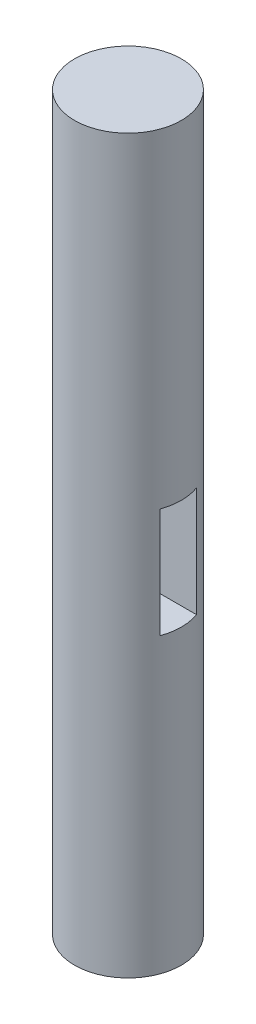
ISO-10303-21;
HEADER;
FILE_DESCRIPTION(('STEP AP214'),'2;1');
FILE_NAME('part.step','',(''),(''),'','','');
FILE_SCHEMA(('AUTOMOTIVE_DESIGN { 1 0 10303 214 1 1 1 1 }'));
ENDSEC;
DATA;
#1=APPLICATION_CONTEXT('core data for automotive mechanical design processes');
#2=APPLICATION_PROTOCOL_DEFINITION('international standard','automotive_design',2000,#1);
#3=PRODUCT_CONTEXT('',#1,'mechanical');
#4=PRODUCT('Part','Part','',(#3));
#5=PRODUCT_RELATED_PRODUCT_CATEGORY('part','',(#4));
#6=PRODUCT_DEFINITION_FORMATION('','',#4);
#7=PRODUCT_DEFINITION_CONTEXT('part definition',#1,'design');
#8=PRODUCT_DEFINITION('design','',#6,#7);
#9=PRODUCT_DEFINITION_SHAPE('','',#8);
#10=(LENGTH_UNIT() NAMED_UNIT(*) SI_UNIT(.MILLI.,.METRE.));
#11=(NAMED_UNIT(*) PLANE_ANGLE_UNIT() SI_UNIT($,.RADIAN.));
#12=(NAMED_UNIT(*) SI_UNIT($,.STERADIAN.) SOLID_ANGLE_UNIT());
#13=UNCERTAINTY_MEASURE_WITH_UNIT(LENGTH_MEASURE(1.E-05),#10,'distance_accuracy_value','');
#14=(GEOMETRIC_REPRESENTATION_CONTEXT(3) GLOBAL_UNCERTAINTY_ASSIGNED_CONTEXT((#13)) GLOBAL_UNIT_ASSIGNED_CONTEXT((#10,
#11,#12)) REPRESENTATION_CONTEXT('',''));
#15=CARTESIAN_POINT('',(0.,0.,0.));
#16=DIRECTION('',(0.,0.,1.));
#17=DIRECTION('',(1.,0.,0.));
#18=AXIS2_PLACEMENT_3D('',#15,#16,#17);
#19=CARTESIAN_POINT('',(0.,127.,0.));
#20=DIRECTION('',(0.,-1.,0.));
#21=DIRECTION('',(0.,0.,-1.));
#22=AXIS2_PLACEMENT_3D('',#19,#20,#21);
#23=CYLINDRICAL_SURFACE('',#22,9.271);
#24=DIRECTION('',(0.,-1.,0.));
#25=VECTOR('',#24,1.);
#26=CARTESIAN_POINT('',(-8.71038552533698,127.,3.17499999999999));
#27=LINE('',#26,#25);
#28=CARTESIAN_POINT('',(-8.71038552533698,69.89064,3.175));
#29=VERTEX_POINT('',#28);
#30=CARTESIAN_POINT('',(-8.71038552533698,50.84064,3.175));
#31=VERTEX_POINT('',#30);
#32=EDGE_CURVE('E11',#29,#31,#27,.T.);
#33=ORIENTED_EDGE('',*,*,#32,.T.);
#34=CARTESIAN_POINT('',(0.,50.84064,0.));
#35=DIRECTION('',(0.,-1.,0.));
#36=DIRECTION('',(0.,0.,-1.));
#37=AXIS2_PLACEMENT_3D('',#34,#35,#36);
#38=CIRCLE('',#37,9.271);
#39=CARTESIAN_POINT('',(-8.71038552533698,50.84064,-3.175));
#40=VERTEX_POINT('',#39);
#41=EDGE_CURVE('E86',#31,#40,#38,.T.);
#42=ORIENTED_EDGE('',*,*,#41,.T.);
#43=DIRECTION('',(0.,-1.,0.));
#44=VECTOR('',#43,1.);
#45=CARTESIAN_POINT('',(-8.71038552533698,127.,-3.17500000000001));
#46=LINE('',#45,#44);
#47=CARTESIAN_POINT('',(-8.71038552533698,69.89064,-3.175));
#48=VERTEX_POINT('',#47);
#49=EDGE_CURVE('E93',#40,#48,#46,.F.);
#50=ORIENTED_EDGE('',*,*,#49,.T.);
#51=CARTESIAN_POINT('',(0.,69.89064,0.));
#52=DIRECTION('',(0.,1.,0.));
#53=DIRECTION('',(0.,0.,1.));
#54=AXIS2_PLACEMENT_3D('',#51,#52,#53);
#55=CIRCLE('',#54,9.271);
#56=EDGE_CURVE('E47',#48,#29,#55,.T.);
#57=ORIENTED_EDGE('',*,*,#56,.T.);
#58=EDGE_LOOP('',(#33,#42,#50,#57));
#59=FACE_BOUND('',#58,.T.);
#60=DIRECTION('',(0.,-1.,0.));
#61=VECTOR('',#60,1.);
#62=CARTESIAN_POINT('',(8.71038552533698,127.,-3.17500000000001));
#63=LINE('',#62,#61);
#64=CARTESIAN_POINT('',(8.71038552533698,69.89064,-3.175));
#65=VERTEX_POINT('',#64);
#66=CARTESIAN_POINT('',(8.71038552533698,50.84064,-3.175));
#67=VERTEX_POINT('',#66);
#68=EDGE_CURVE('E90',#65,#67,#63,.T.);
#69=ORIENTED_EDGE('',*,*,#68,.T.);
#70=CARTESIAN_POINT('',(8.71038552533698,50.84064,3.175));
#71=VERTEX_POINT('',#70);
#72=EDGE_CURVE('E77',#67,#71,#38,.T.);
#73=ORIENTED_EDGE('',*,*,#72,.T.);
#74=DIRECTION('',(0.,-1.,0.));
#75=VECTOR('',#74,1.);
#76=CARTESIAN_POINT('',(8.71038552533698,127.,3.17499999999999));
#77=LINE('',#76,#75);
#78=CARTESIAN_POINT('',(8.71038552533698,69.89064,3.175));
#79=VERTEX_POINT('',#78);
#80=EDGE_CURVE('E101',#71,#79,#77,.F.);
#81=ORIENTED_EDGE('',*,*,#80,.T.);
#82=EDGE_CURVE('E83',#79,#65,#55,.T.);
#83=ORIENTED_EDGE('',*,*,#82,.T.);
#84=EDGE_LOOP('',(#69,#73,#81,#83));
#85=FACE_BOUND('',#84,.T.);
#86=CARTESIAN_POINT('',(0.,127.,0.));
#87=DIRECTION('',(0.,1.,0.));
#88=DIRECTION('',(0.,0.,1.));
#89=AXIS2_PLACEMENT_3D('',#86,#87,#88);
#90=CIRCLE('',#89,9.271);
#91=CARTESIAN_POINT('',(0.,127.,9.271));
#92=VERTEX_POINT('',#91);
#93=EDGE_CURVE('E84',#92,#92,#90,.T.);
#94=ORIENTED_EDGE('',*,*,#93,.F.);
#95=EDGE_LOOP('',(#94));
#96=FACE_BOUND('',#95,.T.);
#97=CARTESIAN_POINT('',(0.,0.,0.));
#98=DIRECTION('',(0.,1.,0.));
#99=DIRECTION('',(0.,0.,1.));
#100=AXIS2_PLACEMENT_3D('',#97,#98,#99);
#101=CIRCLE('',#100,9.271);
#102=CARTESIAN_POINT('',(0.,0.,9.271));
#103=VERTEX_POINT('',#102);
#104=EDGE_CURVE('E115',#103,#103,#101,.T.);
#105=ORIENTED_EDGE('',*,*,#104,.T.);
#106=EDGE_LOOP('',(#105));
#107=FACE_BOUND('',#106,.T.);
#108=ADVANCED_FACE('F39',(#59,#85,#96,#107),#23,.T.);
#109=CARTESIAN_POINT('',(0.,127.,0.));
#110=DIRECTION('',(0.,1.,0.));
#111=DIRECTION('',(0.,0.,1.));
#112=AXIS2_PLACEMENT_3D('',#109,#110,#111);
#113=PLANE('',#112);
#114=ORIENTED_EDGE('',*,*,#93,.T.);
#115=EDGE_LOOP('',(#114));
#116=FACE_BOUND('',#115,.T.);
#117=ADVANCED_FACE('F133',(#116),#113,.T.);
#118=CARTESIAN_POINT('',(0.,0.,0.));
#119=DIRECTION('',(0.,1.,0.));
#120=DIRECTION('',(0.,0.,1.));
#121=AXIS2_PLACEMENT_3D('',#118,#119,#120);
#122=PLANE('',#121);
#123=ORIENTED_EDGE('',*,*,#104,.F.);
#124=EDGE_LOOP('',(#123));
#125=FACE_BOUND('',#124,.T.);
#126=ADVANCED_FACE('F137',(#125),#122,.F.);
#127=CARTESIAN_POINT('',(-9.271,50.84064,3.175));
#128=DIRECTION('',(0.,0.,1.));
#129=DIRECTION('',(0.,-1.,0.));
#130=AXIS2_PLACEMENT_3D('',#127,#128,#129);
#131=PLANE('',#130);
#132=DIRECTION('',(1.,0.,0.));
#133=VECTOR('',#132,1.);
#134=CARTESIAN_POINT('',(-9.271,69.89064,3.175));
#135=LINE('',#134,#133);
#136=EDGE_CURVE('E119',#29,#79,#135,.T.);
#137=ORIENTED_EDGE('',*,*,#136,.T.);
#138=ORIENTED_EDGE('',*,*,#80,.F.);
#139=DIRECTION('',(1.,0.,0.));
#140=VECTOR('',#139,1.);
#141=CARTESIAN_POINT('',(-9.271,50.84064,3.175));
#142=LINE('',#141,#140);
#143=EDGE_CURVE('E59',#31,#71,#142,.T.);
#144=ORIENTED_EDGE('',*,*,#143,.F.);
#145=ORIENTED_EDGE('',*,*,#32,.F.);
#146=EDGE_LOOP('',(#137,#138,#144,#145));
#147=FACE_BOUND('',#146,.T.);
#148=ADVANCED_FACE('F131',(#147),#131,.F.);
#149=CARTESIAN_POINT('',(-9.271,69.89064,3.175));
#150=DIRECTION('',(0.,1.,0.));
#151=DIRECTION('',(0.,0.,1.));
#152=AXIS2_PLACEMENT_3D('',#149,#150,#151);
#153=PLANE('',#152);
#154=ORIENTED_EDGE('',*,*,#136,.F.);
#155=ORIENTED_EDGE('',*,*,#56,.F.);
#156=DIRECTION('',(1.,0.,0.));
#157=VECTOR('',#156,1.);
#158=CARTESIAN_POINT('',(-9.271,69.89064,-3.175));
#159=LINE('',#158,#157);
#160=EDGE_CURVE('E96',#48,#65,#159,.T.);
#161=ORIENTED_EDGE('',*,*,#160,.T.);
#162=ORIENTED_EDGE('',*,*,#82,.F.);
#163=EDGE_LOOP('',(#154,#155,#161,#162));
#164=FACE_BOUND('',#163,.T.);
#165=ADVANCED_FACE('F129',(#164),#153,.F.);
#166=CARTESIAN_POINT('',(-9.271,50.84064,-3.175));
#167=DIRECTION('',(0.,0.,-1.));
#168=DIRECTION('',(0.,1.,0.));
#169=AXIS2_PLACEMENT_3D('',#166,#167,#168);
#170=PLANE('',#169);
#171=ORIENTED_EDGE('',*,*,#160,.F.);
#172=ORIENTED_EDGE('',*,*,#49,.F.);
#173=DIRECTION('',(1.,0.,0.));
#174=VECTOR('',#173,1.);
#175=CARTESIAN_POINT('',(-9.271,50.84064,-3.175));
#176=LINE('',#175,#174);
#177=EDGE_CURVE('E54',#40,#67,#176,.T.);
#178=ORIENTED_EDGE('',*,*,#177,.T.);
#179=ORIENTED_EDGE('',*,*,#68,.F.);
#180=EDGE_LOOP('',(#171,#172,#178,#179));
#181=FACE_BOUND('',#180,.T.);
#182=ADVANCED_FACE('F89',(#181),#170,.F.);
#183=CARTESIAN_POINT('',(-9.271,50.84064,3.175));
#184=DIRECTION('',(0.,-1.,0.));
#185=DIRECTION('',(0.,0.,-1.));
#186=AXIS2_PLACEMENT_3D('',#183,#184,#185);
#187=PLANE('',#186);
#188=ORIENTED_EDGE('',*,*,#177,.F.);
#189=ORIENTED_EDGE('',*,*,#41,.F.);
#190=ORIENTED_EDGE('',*,*,#143,.T.);
#191=ORIENTED_EDGE('',*,*,#72,.F.);
#192=EDGE_LOOP('',(#188,#189,#190,#191));
#193=FACE_BOUND('',#192,.T.);
#194=ADVANCED_FACE('F78',(#193),#187,.F.);
#195=CLOSED_SHELL('',(#108,#117,#126,#148,#165,#182,#194));
#196=MANIFOLD_SOLID_BREP('B2',#195);
#197=ADVANCED_BREP_SHAPE_REPRESENTATION('',(#18,#196),#14);
#198=SHAPE_DEFINITION_REPRESENTATION(#9,#197);
ENDSEC;
END-ISO-10303-21;
